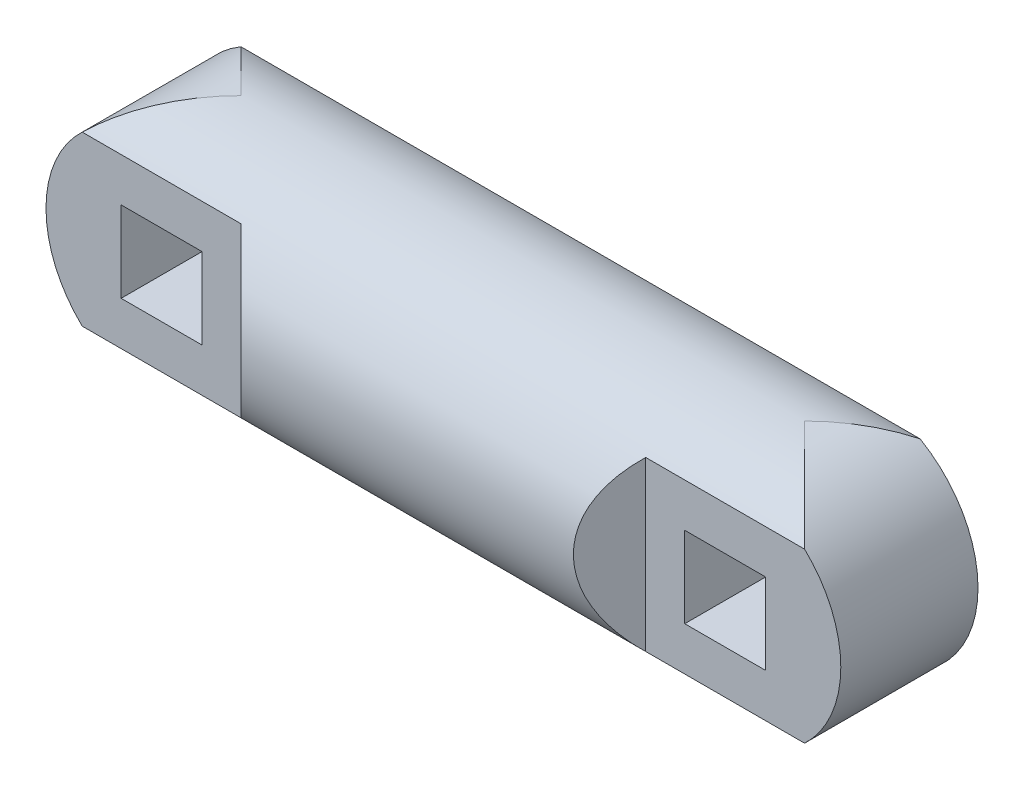
ISO-10303-21;
HEADER;
FILE_DESCRIPTION(('STEP AP214'),'2;1');
FILE_NAME('part.step','',(''),(''),'','','');
FILE_SCHEMA(('AUTOMOTIVE_DESIGN { 1 0 10303 214 1 1 1 1 }'));
ENDSEC;
DATA;
#1=APPLICATION_CONTEXT('core data for automotive mechanical design processes');
#2=APPLICATION_PROTOCOL_DEFINITION('international standard','automotive_design',2000,#1);
#3=PRODUCT_CONTEXT('',#1,'mechanical');
#4=PRODUCT('Part','Part','',(#3));
#5=PRODUCT_RELATED_PRODUCT_CATEGORY('part','',(#4));
#6=PRODUCT_DEFINITION_FORMATION('','',#4);
#7=PRODUCT_DEFINITION_CONTEXT('part definition',#1,'design');
#8=PRODUCT_DEFINITION('design','',#6,#7);
#9=PRODUCT_DEFINITION_SHAPE('','',#8);
#10=(LENGTH_UNIT() NAMED_UNIT(*) SI_UNIT(.MILLI.,.METRE.));
#11=(NAMED_UNIT(*) PLANE_ANGLE_UNIT() SI_UNIT($,.RADIAN.));
#12=(NAMED_UNIT(*) SI_UNIT($,.STERADIAN.) SOLID_ANGLE_UNIT());
#13=UNCERTAINTY_MEASURE_WITH_UNIT(LENGTH_MEASURE(1.E-05),#10,'distance_accuracy_value','');
#14=(GEOMETRIC_REPRESENTATION_CONTEXT(3) GLOBAL_UNCERTAINTY_ASSIGNED_CONTEXT((#13)) GLOBAL_UNIT_ASSIGNED_CONTEXT((#10,
#11,#12)) REPRESENTATION_CONTEXT('',''));
#15=CARTESIAN_POINT('',(0.,0.,0.));
#16=DIRECTION('',(0.,0.,1.));
#17=DIRECTION('',(1.,0.,0.));
#18=AXIS2_PLACEMENT_3D('',#15,#16,#17);
#19=CARTESIAN_POINT('',(-13.75,0.,0.));
#20=DIRECTION('',(1.,0.,0.));
#21=DIRECTION('',(0.,0.,-1.));
#22=AXIS2_PLACEMENT_3D('',#19,#20,#21);
#23=CYLINDRICAL_SURFACE('',#22,4.);
#24=CARTESIAN_POINT('',(9.75,0.,0.));
#25=DIRECTION('',(0.707106781186547,0.,-0.707106781186547));
#26=DIRECTION('',(0.707106781186547,0.,0.707106781186547));
#27=AXIS2_PLACEMENT_3D('',#24,#25,#26);
#28=ELLIPSE('',#27,5.65685424949238,4.);
#29=CARTESIAN_POINT('',(9.75,-4.,0.));
#30=VERTEX_POINT('',#29);
#31=CARTESIAN_POINT('',(12.496998799039,-2.90757589721714,2.74699879903904));
#32=VERTEX_POINT('',#31);
#33=EDGE_CURVE('E159',#30,#32,#28,.F.);
#34=ORIENTED_EDGE('',*,*,#33,.T.);
#35=DIRECTION('',(1.,0.,0.));
#36=VECTOR('',#35,1.);
#37=CARTESIAN_POINT('',(-13.75,-2.90757589721714,2.74699879903904));
#38=LINE('',#37,#36);
#39=CARTESIAN_POINT('',(7.,-2.90757589721714,2.74699879903904));
#40=VERTEX_POINT('',#39);
#41=EDGE_CURVE('E152',#32,#40,#38,.F.);
#42=ORIENTED_EDGE('',*,*,#41,.T.);
#43=CARTESIAN_POINT('',(9.74041916014555,0.,0.));
#44=DIRECTION('',(0.707954122267379,0.,0.706258423499943));
#45=DIRECTION('',(0.706258423499943,0.,-0.707954122267379));
#46=AXIS2_PLACEMENT_3D('',#43,#44,#45);
#47=ELLIPSE('',#46,5.65008363421788,4.);
#48=CARTESIAN_POINT('',(7.,2.90757589721715,2.74699879903904));
#49=VERTEX_POINT('',#48);
#50=EDGE_CURVE('E11',#40,#49,#47,.F.);
#51=ORIENTED_EDGE('',*,*,#50,.T.);
#52=DIRECTION('',(1.,0.,0.));
#53=VECTOR('',#52,1.);
#54=CARTESIAN_POINT('',(-13.75,2.90757589721714,2.74699879903904));
#55=LINE('',#54,#53);
#56=CARTESIAN_POINT('',(12.496998799039,2.90757589721714,2.74699879903904));
#57=VERTEX_POINT('',#56);
#58=EDGE_CURVE('E144',#49,#57,#55,.T.);
#59=ORIENTED_EDGE('',*,*,#58,.T.);
#60=CARTESIAN_POINT('',(9.75,4.,0.));
#61=VERTEX_POINT('',#60);
#62=EDGE_CURVE('E204',#57,#61,#28,.F.);
#63=ORIENTED_EDGE('',*,*,#62,.T.);
#64=CARTESIAN_POINT('',(9.75,0.,0.));
#65=DIRECTION('',(0.707106781186547,0.,0.707106781186547));
#66=DIRECTION('',(0.707106781186547,0.,-0.707106781186547));
#67=AXIS2_PLACEMENT_3D('',#64,#65,#66);
#68=ELLIPSE('',#67,5.65685424949238,4.);
#69=CARTESIAN_POINT('',(11.75,3.46410161513776,-2.));
#70=VERTEX_POINT('',#69);
#71=EDGE_CURVE('E205',#61,#70,#68,.F.);
#72=ORIENTED_EDGE('',*,*,#71,.T.);
#73=DIRECTION('',(1.,0.,0.));
#74=VECTOR('',#73,1.);
#75=CARTESIAN_POINT('',(-13.75,3.46410161513776,-2.));
#76=LINE('',#75,#74);
#77=CARTESIAN_POINT('',(-11.75,3.46410161513776,-2.));
#78=VERTEX_POINT('',#77);
#79=EDGE_CURVE('E224',#78,#70,#76,.T.);
#80=ORIENTED_EDGE('',*,*,#79,.F.);
#81=CARTESIAN_POINT('',(-9.75,0.,0.));
#82=DIRECTION('',(0.707106781186547,0.,-0.707106781186547));
#83=DIRECTION('',(0.707106781186547,0.,0.707106781186547));
#84=AXIS2_PLACEMENT_3D('',#81,#82,#83);
#85=ELLIPSE('',#84,5.65685424949238,4.);
#86=CARTESIAN_POINT('',(-9.75,4.,0.));
#87=VERTEX_POINT('',#86);
#88=EDGE_CURVE('E197',#78,#87,#85,.T.);
#89=ORIENTED_EDGE('',*,*,#88,.T.);
#90=CARTESIAN_POINT('',(-9.75,0.,0.));
#91=DIRECTION('',(0.707106781186547,0.,0.707106781186547));
#92=DIRECTION('',(0.707106781186547,0.,-0.707106781186547));
#93=AXIS2_PLACEMENT_3D('',#90,#91,#92);
#94=ELLIPSE('',#93,5.65685424949238,4.);
#95=CARTESIAN_POINT('',(-12.496998799039,2.90757589721714,2.74699879903904));
#96=VERTEX_POINT('',#95);
#97=EDGE_CURVE('E194',#87,#96,#94,.T.);
#98=ORIENTED_EDGE('',*,*,#97,.T.);
#99=DIRECTION('',(1.,0.,0.));
#100=VECTOR('',#99,1.);
#101=CARTESIAN_POINT('',(-13.75,2.90757589721714,2.74699879903904));
#102=LINE('',#101,#100);
#103=CARTESIAN_POINT('',(-7.,2.90757589721714,2.74699879903904));
#104=VERTEX_POINT('',#103);
#105=EDGE_CURVE('E174',#96,#104,#102,.T.);
#106=ORIENTED_EDGE('',*,*,#105,.T.);
#107=CARTESIAN_POINT('',(-9.74041916014555,0.,0.));
#108=DIRECTION('',(-0.707954122267379,0.,0.706258423499943));
#109=DIRECTION('',(0.706258423499943,0.,0.707954122267379));
#110=AXIS2_PLACEMENT_3D('',#107,#108,#109);
#111=ELLIPSE('',#110,5.65008363421788,4.);
#112=CARTESIAN_POINT('',(-7.,-2.90757589721714,2.74699879903904));
#113=VERTEX_POINT('',#112);
#114=EDGE_CURVE('E254',#104,#113,#111,.F.);
#115=ORIENTED_EDGE('',*,*,#114,.T.);
#116=DIRECTION('',(1.,0.,0.));
#117=VECTOR('',#116,1.);
#118=CARTESIAN_POINT('',(-13.75,-2.90757589721714,2.74699879903904));
#119=LINE('',#118,#117);
#120=CARTESIAN_POINT('',(-12.496998799039,-2.90757589721714,2.74699879903904));
#121=VERTEX_POINT('',#120);
#122=EDGE_CURVE('E177',#113,#121,#119,.F.);
#123=ORIENTED_EDGE('',*,*,#122,.T.);
#124=CARTESIAN_POINT('',(-9.75,-4.,0.));
#125=VERTEX_POINT('',#124);
#126=EDGE_CURVE('E189',#121,#125,#94,.T.);
#127=ORIENTED_EDGE('',*,*,#126,.T.);
#128=CARTESIAN_POINT('',(-11.75,-3.46410161513775,-2.));
#129=VERTEX_POINT('',#128);
#130=EDGE_CURVE('E193',#125,#129,#85,.T.);
#131=ORIENTED_EDGE('',*,*,#130,.T.);
#132=DIRECTION('',(1.,0.,0.));
#133=VECTOR('',#132,1.);
#134=CARTESIAN_POINT('',(-13.75,-3.46410161513775,-2.));
#135=LINE('',#134,#133);
#136=CARTESIAN_POINT('',(11.75,-3.46410161513775,-2.));
#137=VERTEX_POINT('',#136);
#138=EDGE_CURVE('E223',#129,#137,#135,.T.);
#139=ORIENTED_EDGE('',*,*,#138,.T.);
#140=EDGE_CURVE('E202',#137,#30,#68,.F.);
#141=ORIENTED_EDGE('',*,*,#140,.T.);
#142=EDGE_LOOP('',(#34,#42,#51,#59,#63,#72,#80,#89,#98,#106,#115,#123,#127,#131,#139,#141));
#143=FACE_BOUND('',#142,.T.);
#144=ADVANCED_FACE('F32',(#143),#23,.T.);
#145=CARTESIAN_POINT('',(11.15,1.4,13.75));
#146=DIRECTION('',(-1.,0.,0.));
#147=DIRECTION('',(0.,0.,1.));
#148=AXIS2_PLACEMENT_3D('',#145,#146,#147);
#149=PLANE('',#148);
#150=DIRECTION('',(0.,0.,-1.));
#151=VECTOR('',#150,1.);
#152=CARTESIAN_POINT('',(11.15,-1.4,13.75));
#153=LINE('',#152,#151);
#154=CARTESIAN_POINT('',(11.15,-1.4,2.74699879903904));
#155=VERTEX_POINT('',#154);
#156=CARTESIAN_POINT('',(11.15,-1.4,-2.));
#157=VERTEX_POINT('',#156);
#158=EDGE_CURVE('E215',#155,#157,#153,.T.);
#159=ORIENTED_EDGE('',*,*,#158,.F.);
#160=DIRECTION('',(0.,1.,0.));
#161=VECTOR('',#160,1.);
#162=CARTESIAN_POINT('',(11.15,1.4,2.74699879903904));
#163=LINE('',#162,#161);
#164=CARTESIAN_POINT('',(11.15,1.4,2.74699879903904));
#165=VERTEX_POINT('',#164);
#166=EDGE_CURVE('E46',#155,#165,#163,.T.);
#167=ORIENTED_EDGE('',*,*,#166,.T.);
#168=DIRECTION('',(0.,0.,-1.));
#169=VECTOR('',#168,1.);
#170=CARTESIAN_POINT('',(11.15,1.4,13.75));
#171=LINE('',#170,#169);
#172=CARTESIAN_POINT('',(11.15,1.4,-2.));
#173=VERTEX_POINT('',#172);
#174=EDGE_CURVE('E221',#165,#173,#171,.T.);
#175=ORIENTED_EDGE('',*,*,#174,.T.);
#176=DIRECTION('',(0.,1.,0.));
#177=VECTOR('',#176,1.);
#178=CARTESIAN_POINT('',(11.15,3.46410161513776,-2.));
#179=LINE('',#178,#177);
#180=EDGE_CURVE('E236',#157,#173,#179,.T.);
#181=ORIENTED_EDGE('',*,*,#180,.F.);
#182=EDGE_LOOP('',(#159,#167,#175,#181));
#183=FACE_BOUND('',#182,.T.);
#184=ADVANCED_FACE('F287',(#183),#149,.T.);
#185=CARTESIAN_POINT('',(8.35,1.4,13.75));
#186=DIRECTION('',(0.,-1.,0.));
#187=DIRECTION('',(1.,0.,0.));
#188=AXIS2_PLACEMENT_3D('',#185,#186,#187);
#189=PLANE('',#188);
#190=ORIENTED_EDGE('',*,*,#174,.F.);
#191=DIRECTION('',(-1.,0.,0.));
#192=VECTOR('',#191,1.);
#193=CARTESIAN_POINT('',(8.35,1.4,2.74699879903904));
#194=LINE('',#193,#192);
#195=CARTESIAN_POINT('',(8.35,1.4,2.74699879903904));
#196=VERTEX_POINT('',#195);
#197=EDGE_CURVE('E167',#165,#196,#194,.T.);
#198=ORIENTED_EDGE('',*,*,#197,.T.);
#199=DIRECTION('',(0.,0.,-1.));
#200=VECTOR('',#199,1.);
#201=CARTESIAN_POINT('',(8.35,1.4,13.75));
#202=LINE('',#201,#200);
#203=CARTESIAN_POINT('',(8.35,1.4,-2.));
#204=VERTEX_POINT('',#203);
#205=EDGE_CURVE('E219',#196,#204,#202,.T.);
#206=ORIENTED_EDGE('',*,*,#205,.T.);
#207=DIRECTION('',(-1.,0.,0.));
#208=VECTOR('',#207,1.);
#209=CARTESIAN_POINT('',(-13.75,1.4,-2.));
#210=LINE('',#209,#208);
#211=EDGE_CURVE('E233',#173,#204,#210,.T.);
#212=ORIENTED_EDGE('',*,*,#211,.F.);
#213=EDGE_LOOP('',(#190,#198,#206,#212));
#214=FACE_BOUND('',#213,.T.);
#215=ADVANCED_FACE('F291',(#214),#189,.T.);
#216=CARTESIAN_POINT('',(8.35,1.4,13.75));
#217=DIRECTION('',(1.,0.,0.));
#218=DIRECTION('',(0.,0.,-1.));
#219=AXIS2_PLACEMENT_3D('',#216,#217,#218);
#220=PLANE('',#219);
#221=ORIENTED_EDGE('',*,*,#205,.F.);
#222=DIRECTION('',(0.,-1.,0.));
#223=VECTOR('',#222,1.);
#224=CARTESIAN_POINT('',(8.35,1.4,2.74699879903904));
#225=LINE('',#224,#223);
#226=CARTESIAN_POINT('',(8.35,-1.4,2.74699879903904));
#227=VERTEX_POINT('',#226);
#228=EDGE_CURVE('E162',#196,#227,#225,.T.);
#229=ORIENTED_EDGE('',*,*,#228,.T.);
#230=DIRECTION('',(0.,0.,-1.));
#231=VECTOR('',#230,1.);
#232=CARTESIAN_POINT('',(8.35,-1.4,13.75));
#233=LINE('',#232,#231);
#234=CARTESIAN_POINT('',(8.35,-1.4,-2.));
#235=VERTEX_POINT('',#234);
#236=EDGE_CURVE('E217',#227,#235,#233,.T.);
#237=ORIENTED_EDGE('',*,*,#236,.T.);
#238=DIRECTION('',(0.,-1.,0.));
#239=VECTOR('',#238,1.);
#240=CARTESIAN_POINT('',(8.35,3.46410161513776,-2.));
#241=LINE('',#240,#239);
#242=EDGE_CURVE('E230',#204,#235,#241,.T.);
#243=ORIENTED_EDGE('',*,*,#242,.F.);
#244=EDGE_LOOP('',(#221,#229,#237,#243));
#245=FACE_BOUND('',#244,.T.);
#246=ADVANCED_FACE('F297',(#245),#220,.T.);
#247=CARTESIAN_POINT('',(8.35,-1.4,13.75));
#248=DIRECTION('',(0.,1.,0.));
#249=DIRECTION('',(0.,0.,1.));
#250=AXIS2_PLACEMENT_3D('',#247,#248,#249);
#251=PLANE('',#250);
#252=ORIENTED_EDGE('',*,*,#236,.F.);
#253=DIRECTION('',(1.,0.,0.));
#254=VECTOR('',#253,1.);
#255=CARTESIAN_POINT('',(8.35,-1.4,2.74699879903904));
#256=LINE('',#255,#254);
#257=EDGE_CURVE('E160',#227,#155,#256,.T.);
#258=ORIENTED_EDGE('',*,*,#257,.T.);
#259=ORIENTED_EDGE('',*,*,#158,.T.);
#260=DIRECTION('',(1.,0.,0.));
#261=VECTOR('',#260,1.);
#262=CARTESIAN_POINT('',(-13.75,-1.4,-2.));
#263=LINE('',#262,#261);
#264=EDGE_CURVE('E226',#235,#157,#263,.T.);
#265=ORIENTED_EDGE('',*,*,#264,.F.);
#266=EDGE_LOOP('',(#252,#258,#259,#265));
#267=FACE_BOUND('',#266,.T.);
#268=ADVANCED_FACE('F304',(#267),#251,.T.);
#269=CARTESIAN_POINT('',(9.75,0.,13.75));
#270=DIRECTION('',(0.,0.,-1.));
#271=DIRECTION('',(-1.,0.,0.));
#272=AXIS2_PLACEMENT_3D('',#269,#270,#271);
#273=CYLINDRICAL_SURFACE('',#272,4.);
#274=CARTESIAN_POINT('',(9.75,0.,2.74699879903904));
#275=DIRECTION('',(0.,0.,1.));
#276=DIRECTION('',(1.,0.,0.));
#277=AXIS2_PLACEMENT_3D('',#274,#275,#276);
#278=CIRCLE('',#277,4.);
#279=EDGE_CURVE('E39',#57,#32,#278,.F.);
#280=ORIENTED_EDGE('',*,*,#279,.T.);
#281=ORIENTED_EDGE('',*,*,#33,.F.);
#282=ORIENTED_EDGE('',*,*,#140,.F.);
#283=CARTESIAN_POINT('',(9.75,0.,-2.));
#284=DIRECTION('',(0.,0.,-1.));
#285=DIRECTION('',(0.,1.,0.));
#286=AXIS2_PLACEMENT_3D('',#283,#284,#285);
#287=CIRCLE('',#286,4.);
#288=EDGE_CURVE('E192',#70,#137,#287,.T.);
#289=ORIENTED_EDGE('',*,*,#288,.F.);
#290=ORIENTED_EDGE('',*,*,#71,.F.);
#291=ORIENTED_EDGE('',*,*,#62,.F.);
#292=EDGE_LOOP('',(#280,#281,#282,#289,#290,#291));
#293=FACE_BOUND('',#292,.T.);
#294=ADVANCED_FACE('F256',(#293),#273,.T.);
#295=CARTESIAN_POINT('',(-8.35,1.4,13.75));
#296=DIRECTION('',(-1.,0.,0.));
#297=DIRECTION('',(0.,0.,1.));
#298=AXIS2_PLACEMENT_3D('',#295,#296,#297);
#299=PLANE('',#298);
#300=DIRECTION('',(0.,0.,-1.));
#301=VECTOR('',#300,1.);
#302=CARTESIAN_POINT('',(-8.35,-1.4,13.75));
#303=LINE('',#302,#301);
#304=CARTESIAN_POINT('',(-8.35,-1.4,2.74699879903904));
#305=VERTEX_POINT('',#304);
#306=CARTESIAN_POINT('',(-8.35,-1.4,-2.));
#307=VERTEX_POINT('',#306);
#308=EDGE_CURVE('E207',#305,#307,#303,.T.);
#309=ORIENTED_EDGE('',*,*,#308,.F.);
#310=DIRECTION('',(0.,1.,0.));
#311=VECTOR('',#310,1.);
#312=CARTESIAN_POINT('',(-8.35,1.4,2.74699879903904));
#313=LINE('',#312,#311);
#314=CARTESIAN_POINT('',(-8.35,1.4,2.74699879903904));
#315=VERTEX_POINT('',#314);
#316=EDGE_CURVE('E54',#305,#315,#313,.T.);
#317=ORIENTED_EDGE('',*,*,#316,.T.);
#318=DIRECTION('',(0.,0.,-1.));
#319=VECTOR('',#318,1.);
#320=CARTESIAN_POINT('',(-8.35,1.4,13.75));
#321=LINE('',#320,#319);
#322=CARTESIAN_POINT('',(-8.35,1.4,-2.));
#323=VERTEX_POINT('',#322);
#324=EDGE_CURVE('E213',#315,#323,#321,.T.);
#325=ORIENTED_EDGE('',*,*,#324,.T.);
#326=DIRECTION('',(0.,1.,0.));
#327=VECTOR('',#326,1.);
#328=CARTESIAN_POINT('',(-8.35,3.46410161513776,-2.));
#329=LINE('',#328,#327);
#330=EDGE_CURVE('E248',#307,#323,#329,.T.);
#331=ORIENTED_EDGE('',*,*,#330,.F.);
#332=EDGE_LOOP('',(#309,#317,#325,#331));
#333=FACE_BOUND('',#332,.T.);
#334=ADVANCED_FACE('F309',(#333),#299,.T.);
#335=CARTESIAN_POINT('',(-8.35,1.4,13.75));
#336=DIRECTION('',(0.,-1.,0.));
#337=DIRECTION('',(1.,0.,0.));
#338=AXIS2_PLACEMENT_3D('',#335,#336,#337);
#339=PLANE('',#338);
#340=ORIENTED_EDGE('',*,*,#324,.F.);
#341=DIRECTION('',(-1.,0.,0.));
#342=VECTOR('',#341,1.);
#343=CARTESIAN_POINT('',(-8.35,1.4,2.74699879903904));
#344=LINE('',#343,#342);
#345=CARTESIAN_POINT('',(-11.15,1.4,2.74699879903904));
#346=VERTEX_POINT('',#345);
#347=EDGE_CURVE('E185',#315,#346,#344,.T.);
#348=ORIENTED_EDGE('',*,*,#347,.T.);
#349=DIRECTION('',(0.,0.,-1.));
#350=VECTOR('',#349,1.);
#351=CARTESIAN_POINT('',(-11.15,1.4,13.75));
#352=LINE('',#351,#350);
#353=CARTESIAN_POINT('',(-11.15,1.4,-2.));
#354=VERTEX_POINT('',#353);
#355=EDGE_CURVE('E211',#346,#354,#352,.T.);
#356=ORIENTED_EDGE('',*,*,#355,.T.);
#357=DIRECTION('',(-1.,0.,0.));
#358=VECTOR('',#357,1.);
#359=CARTESIAN_POINT('',(-13.75,1.4,-2.));
#360=LINE('',#359,#358);
#361=EDGE_CURVE('E245',#323,#354,#360,.T.);
#362=ORIENTED_EDGE('',*,*,#361,.F.);
#363=EDGE_LOOP('',(#340,#348,#356,#362));
#364=FACE_BOUND('',#363,.T.);
#365=ADVANCED_FACE('F312',(#364),#339,.T.);
#366=CARTESIAN_POINT('',(-11.15,1.4,13.75));
#367=DIRECTION('',(1.,0.,0.));
#368=DIRECTION('',(0.,0.,-1.));
#369=AXIS2_PLACEMENT_3D('',#366,#367,#368);
#370=PLANE('',#369);
#371=ORIENTED_EDGE('',*,*,#355,.F.);
#372=DIRECTION('',(0.,-1.,0.));
#373=VECTOR('',#372,1.);
#374=CARTESIAN_POINT('',(-11.15,1.4,2.74699879903904));
#375=LINE('',#374,#373);
#376=CARTESIAN_POINT('',(-11.15,-1.4,2.74699879903904));
#377=VERTEX_POINT('',#376);
#378=EDGE_CURVE('E182',#346,#377,#375,.T.);
#379=ORIENTED_EDGE('',*,*,#378,.T.);
#380=DIRECTION('',(0.,0.,-1.));
#381=VECTOR('',#380,1.);
#382=CARTESIAN_POINT('',(-11.15,-1.4,13.75));
#383=LINE('',#382,#381);
#384=CARTESIAN_POINT('',(-11.15,-1.4,-2.));
#385=VERTEX_POINT('',#384);
#386=EDGE_CURVE('E209',#377,#385,#383,.T.);
#387=ORIENTED_EDGE('',*,*,#386,.T.);
#388=DIRECTION('',(0.,-1.,0.));
#389=VECTOR('',#388,1.);
#390=CARTESIAN_POINT('',(-11.15,3.46410161513776,-2.));
#391=LINE('',#390,#389);
#392=EDGE_CURVE('E242',#354,#385,#391,.T.);
#393=ORIENTED_EDGE('',*,*,#392,.F.);
#394=EDGE_LOOP('',(#371,#379,#387,#393));
#395=FACE_BOUND('',#394,.T.);
#396=ADVANCED_FACE('F316',(#395),#370,.T.);
#397=CARTESIAN_POINT('',(-8.35,-1.4,13.75));
#398=DIRECTION('',(0.,1.,0.));
#399=DIRECTION('',(0.,0.,1.));
#400=AXIS2_PLACEMENT_3D('',#397,#398,#399);
#401=PLANE('',#400);
#402=ORIENTED_EDGE('',*,*,#386,.F.);
#403=DIRECTION('',(1.,0.,0.));
#404=VECTOR('',#403,1.);
#405=CARTESIAN_POINT('',(-8.35,-1.4,2.74699879903904));
#406=LINE('',#405,#404);
#407=EDGE_CURVE('E180',#377,#305,#406,.T.);
#408=ORIENTED_EDGE('',*,*,#407,.T.);
#409=ORIENTED_EDGE('',*,*,#308,.T.);
#410=DIRECTION('',(1.,0.,0.));
#411=VECTOR('',#410,1.);
#412=CARTESIAN_POINT('',(-13.75,-1.4,-2.));
#413=LINE('',#412,#411);
#414=EDGE_CURVE('E239',#385,#307,#413,.T.);
#415=ORIENTED_EDGE('',*,*,#414,.F.);
#416=EDGE_LOOP('',(#402,#408,#409,#415));
#417=FACE_BOUND('',#416,.T.);
#418=ADVANCED_FACE('F320',(#417),#401,.T.);
#419=CARTESIAN_POINT('',(-9.75,0.,13.75));
#420=DIRECTION('',(0.,0.,-1.));
#421=DIRECTION('',(-1.,0.,0.));
#422=AXIS2_PLACEMENT_3D('',#419,#420,#421);
#423=CYLINDRICAL_SURFACE('',#422,4.);
#424=ORIENTED_EDGE('',*,*,#126,.F.);
#425=CARTESIAN_POINT('',(-9.75,0.,2.74699879903904));
#426=DIRECTION('',(0.,0.,1.));
#427=DIRECTION('',(1.,0.,0.));
#428=AXIS2_PLACEMENT_3D('',#425,#426,#427);
#429=CIRCLE('',#428,4.);
#430=EDGE_CURVE('E251',#121,#96,#429,.F.);
#431=ORIENTED_EDGE('',*,*,#430,.T.);
#432=ORIENTED_EDGE('',*,*,#97,.F.);
#433=ORIENTED_EDGE('',*,*,#88,.F.);
#434=CARTESIAN_POINT('',(-9.75,0.,-2.));
#435=DIRECTION('',(0.,0.,-1.));
#436=DIRECTION('',(0.,1.,0.));
#437=AXIS2_PLACEMENT_3D('',#434,#435,#436);
#438=CIRCLE('',#437,4.);
#439=EDGE_CURVE('E190',#129,#78,#438,.T.);
#440=ORIENTED_EDGE('',*,*,#439,.F.);
#441=ORIENTED_EDGE('',*,*,#130,.F.);
#442=EDGE_LOOP('',(#424,#431,#432,#433,#440,#441));
#443=FACE_BOUND('',#442,.T.);
#444=ADVANCED_FACE('F270',(#443),#423,.T.);
#445=CARTESIAN_POINT('',(-13.75,3.46410161513776,-2.));
#446=DIRECTION('',(0.,0.,-1.));
#447=DIRECTION('',(0.,1.,0.));
#448=AXIS2_PLACEMENT_3D('',#445,#446,#447);
#449=PLANE('',#448);
#450=ORIENTED_EDGE('',*,*,#264,.T.);
#451=ORIENTED_EDGE('',*,*,#180,.T.);
#452=ORIENTED_EDGE('',*,*,#211,.T.);
#453=ORIENTED_EDGE('',*,*,#242,.T.);
#454=EDGE_LOOP('',(#450,#451,#452,#453));
#455=FACE_BOUND('',#454,.T.);
#456=ORIENTED_EDGE('',*,*,#414,.T.);
#457=ORIENTED_EDGE('',*,*,#330,.T.);
#458=ORIENTED_EDGE('',*,*,#361,.T.);
#459=ORIENTED_EDGE('',*,*,#392,.T.);
#460=EDGE_LOOP('',(#456,#457,#458,#459));
#461=FACE_BOUND('',#460,.T.);
#462=ORIENTED_EDGE('',*,*,#138,.F.);
#463=ORIENTED_EDGE('',*,*,#439,.T.);
#464=ORIENTED_EDGE('',*,*,#79,.T.);
#465=ORIENTED_EDGE('',*,*,#288,.T.);
#466=EDGE_LOOP('',(#462,#463,#464,#465));
#467=FACE_BOUND('',#466,.T.);
#468=ADVANCED_FACE('F265',(#455,#461,#467),#449,.T.);
#469=CARTESIAN_POINT('',(-7.,13.75,2.74699879903904));
#470=DIRECTION('',(-0.707954122267379,0.,0.706258423499943));
#471=DIRECTION('',(0.706258423499943,0.,0.707954122267379));
#472=AXIS2_PLACEMENT_3D('',#469,#470,#471);
#473=PLANE('',#472);
#474=ORIENTED_EDGE('',*,*,#114,.F.);
#475=DIRECTION('',(0.,-1.,0.));
#476=VECTOR('',#475,1.);
#477=CARTESIAN_POINT('',(-7.,13.75,2.74699879903904));
#478=LINE('',#477,#476);
#479=EDGE_CURVE('E171',#104,#113,#478,.T.);
#480=ORIENTED_EDGE('',*,*,#479,.T.);
#481=EDGE_LOOP('',(#474,#480));
#482=FACE_BOUND('',#481,.T.);
#483=ADVANCED_FACE('F276',(#482),#473,.T.);
#484=CARTESIAN_POINT('',(-7.,13.75,2.74699879903904));
#485=DIRECTION('',(0.,0.,1.));
#486=DIRECTION('',(1.,0.,0.));
#487=AXIS2_PLACEMENT_3D('',#484,#485,#486);
#488=PLANE('',#487);
#489=ORIENTED_EDGE('',*,*,#407,.F.);
#490=ORIENTED_EDGE('',*,*,#378,.F.);
#491=ORIENTED_EDGE('',*,*,#347,.F.);
#492=ORIENTED_EDGE('',*,*,#316,.F.);
#493=EDGE_LOOP('',(#489,#490,#491,#492));
#494=FACE_BOUND('',#493,.T.);
#495=ORIENTED_EDGE('',*,*,#479,.F.);
#496=ORIENTED_EDGE('',*,*,#105,.F.);
#497=ORIENTED_EDGE('',*,*,#430,.F.);
#498=ORIENTED_EDGE('',*,*,#122,.F.);
#499=EDGE_LOOP('',(#495,#496,#497,#498));
#500=FACE_BOUND('',#499,.T.);
#501=ADVANCED_FACE('F274',(#494,#500),#488,.T.);
#502=CARTESIAN_POINT('',(7.,13.75,2.74699879903904));
#503=DIRECTION('',(0.,0.,1.));
#504=DIRECTION('',(1.,0.,0.));
#505=AXIS2_PLACEMENT_3D('',#502,#503,#504);
#506=PLANE('',#505);
#507=ORIENTED_EDGE('',*,*,#257,.F.);
#508=ORIENTED_EDGE('',*,*,#228,.F.);
#509=ORIENTED_EDGE('',*,*,#197,.F.);
#510=ORIENTED_EDGE('',*,*,#166,.F.);
#511=EDGE_LOOP('',(#507,#508,#509,#510));
#512=FACE_BOUND('',#511,.T.);
#513=ORIENTED_EDGE('',*,*,#41,.F.);
#514=ORIENTED_EDGE('',*,*,#279,.F.);
#515=ORIENTED_EDGE('',*,*,#58,.F.);
#516=DIRECTION('',(0.,-1.,0.));
#517=VECTOR('',#516,1.);
#518=CARTESIAN_POINT('',(7.,13.75,2.74699879903904));
#519=LINE('',#518,#517);
#520=EDGE_CURVE('E148',#49,#40,#519,.T.);
#521=ORIENTED_EDGE('',*,*,#520,.T.);
#522=EDGE_LOOP('',(#513,#514,#515,#521));
#523=FACE_BOUND('',#522,.T.);
#524=ADVANCED_FACE('F147',(#512,#523),#506,.T.);
#525=CARTESIAN_POINT('',(7.,13.75,2.74699879903904));
#526=DIRECTION('',(0.707954122267379,0.,0.706258423499943));
#527=DIRECTION('',(0.706258423499943,0.,-0.707954122267379));
#528=AXIS2_PLACEMENT_3D('',#525,#526,#527);
#529=PLANE('',#528);
#530=ORIENTED_EDGE('',*,*,#520,.F.);
#531=ORIENTED_EDGE('',*,*,#50,.F.);
#532=EDGE_LOOP('',(#530,#531));
#533=FACE_BOUND('',#532,.T.);
#534=ADVANCED_FACE('F155',(#533),#529,.T.);
#535=CLOSED_SHELL('',(#144,#184,#215,#246,#268,#294,#334,#365,#396,#418,#444,#468,#483,#501,
#524,#534));
#536=MANIFOLD_SOLID_BREP('B2',#535);
#537=ADVANCED_BREP_SHAPE_REPRESENTATION('',(#18,#536),#14);
#538=SHAPE_DEFINITION_REPRESENTATION(#9,#537);
ENDSEC;
END-ISO-10303-21;
